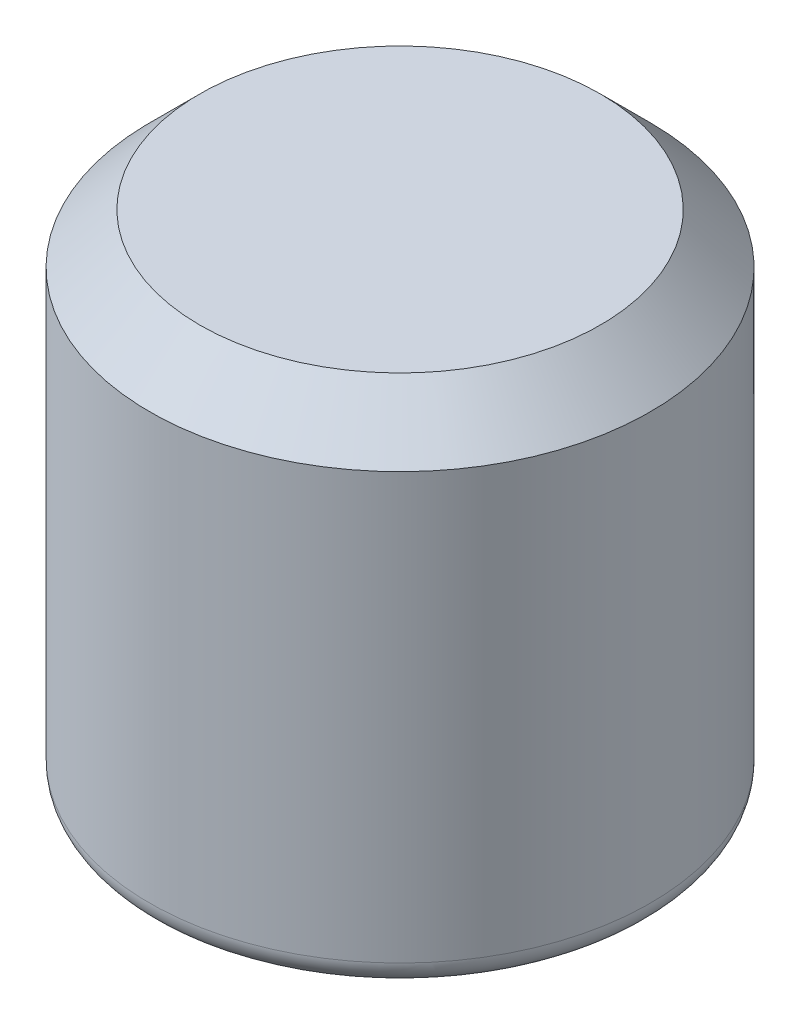
ISO-10303-21;
HEADER;
FILE_DESCRIPTION(('STEP AP214'),'2;1');
FILE_NAME('part.step','',(''),(''),'','','');
FILE_SCHEMA(('AUTOMOTIVE_DESIGN { 1 0 10303 214 1 1 1 1 }'));
ENDSEC;
DATA;
#1=APPLICATION_CONTEXT('core data for automotive mechanical design processes');
#2=APPLICATION_PROTOCOL_DEFINITION('international standard','automotive_design',2000,#1);
#3=PRODUCT_CONTEXT('',#1,'mechanical');
#4=PRODUCT('Part','Part','',(#3));
#5=PRODUCT_RELATED_PRODUCT_CATEGORY('part','',(#4));
#6=PRODUCT_DEFINITION_FORMATION('','',#4);
#7=PRODUCT_DEFINITION_CONTEXT('part definition',#1,'design');
#8=PRODUCT_DEFINITION('design','',#6,#7);
#9=PRODUCT_DEFINITION_SHAPE('','',#8);
#10=(LENGTH_UNIT() NAMED_UNIT(*) SI_UNIT(.MILLI.,.METRE.));
#11=(NAMED_UNIT(*) PLANE_ANGLE_UNIT() SI_UNIT($,.RADIAN.));
#12=(NAMED_UNIT(*) SI_UNIT($,.STERADIAN.) SOLID_ANGLE_UNIT());
#13=UNCERTAINTY_MEASURE_WITH_UNIT(LENGTH_MEASURE(1.E-05),#10,'distance_accuracy_value','');
#14=(GEOMETRIC_REPRESENTATION_CONTEXT(3) GLOBAL_UNCERTAINTY_ASSIGNED_CONTEXT((#13)) GLOBAL_UNIT_ASSIGNED_CONTEXT((#10,
#11,#12)) REPRESENTATION_CONTEXT('',''));
#15=CARTESIAN_POINT('',(0.,0.,0.));
#16=DIRECTION('',(0.,0.,1.));
#17=DIRECTION('',(1.,0.,0.));
#18=AXIS2_PLACEMENT_3D('',#15,#16,#17);
#19=CARTESIAN_POINT('',(0.,0.,0.));
#20=DIRECTION('',(0.,-1.,0.));
#21=DIRECTION('',(0.,0.,-1.));
#22=AXIS2_PLACEMENT_3D('',#19,#20,#21);
#23=PLANE('',#22);
#24=CARTESIAN_POINT('',(0.,0.,0.));
#25=DIRECTION('',(0.,-1.,0.));
#26=DIRECTION('',(0.,0.,-1.));
#27=AXIS2_PLACEMENT_3D('',#24,#25,#26);
#28=CIRCLE('',#27,9.);
#29=CARTESIAN_POINT('',(0.,0.,-9.));
#30=VERTEX_POINT('',#29);
#31=EDGE_CURVE('E47',#30,#30,#28,.T.);
#32=ORIENTED_EDGE('',*,*,#31,.T.);
#33=EDGE_LOOP('',(#32));
#34=FACE_BOUND('',#33,.T.);
#35=ADVANCED_FACE('F40',(#34),#23,.T.);
#36=CARTESIAN_POINT('',(0.,-10.,0.));
#37=DIRECTION('',(0.,-1.,0.));
#38=DIRECTION('',(0.,0.,-1.));
#39=AXIS2_PLACEMENT_3D('',#36,#37,#38);
#40=CYLINDRICAL_SURFACE('',#39,10.);
#41=CARTESIAN_POINT('',(0.,0.999999999999999,0.));
#42=DIRECTION('',(0.,-1.,0.));
#43=DIRECTION('',(0.,0.,-1.));
#44=AXIS2_PLACEMENT_3D('',#41,#42,#43);
#45=CIRCLE('',#44,10.);
#46=CARTESIAN_POINT('',(0.,0.999999999999999,-10.));
#47=VERTEX_POINT('',#46);
#48=EDGE_CURVE('E10',#47,#47,#45,.F.);
#49=ORIENTED_EDGE('',*,*,#48,.T.);
#50=EDGE_LOOP('',(#49));
#51=FACE_BOUND('',#50,.T.);
#52=CARTESIAN_POINT('',(0.,18.,0.));
#53=DIRECTION('',(0.,-1.,0.));
#54=DIRECTION('',(0.,0.,-1.));
#55=AXIS2_PLACEMENT_3D('',#52,#53,#54);
#56=CIRCLE('',#55,10.);
#57=CARTESIAN_POINT('',(0.,18.,-10.));
#58=VERTEX_POINT('',#57);
#59=EDGE_CURVE('E51',#58,#58,#56,.T.);
#60=ORIENTED_EDGE('',*,*,#59,.T.);
#61=EDGE_LOOP('',(#60));
#62=FACE_BOUND('',#61,.T.);
#63=ADVANCED_FACE('F73',(#51,#62),#40,.T.);
#64=CARTESIAN_POINT('',(0.,18.,0.));
#65=DIRECTION('',(0.,-1.,0.));
#66=DIRECTION('',(0.,0.,-1.));
#67=AXIS2_PLACEMENT_3D('',#64,#65,#66);
#68=CONICAL_SURFACE('',#67,10.,0.785398163397448);
#69=CARTESIAN_POINT('',(0.,20.,0.));
#70=DIRECTION('',(0.,-1.,0.));
#71=DIRECTION('',(0.,0.,-1.));
#72=AXIS2_PLACEMENT_3D('',#69,#70,#71);
#73=CIRCLE('',#72,8.);
#74=CARTESIAN_POINT('',(0.,20.,-8.));
#75=VERTEX_POINT('',#74);
#76=EDGE_CURVE('E55',#75,#75,#73,.T.);
#77=ORIENTED_EDGE('',*,*,#76,.T.);
#78=EDGE_LOOP('',(#77));
#79=FACE_BOUND('',#78,.T.);
#80=ORIENTED_EDGE('',*,*,#59,.F.);
#81=EDGE_LOOP('',(#80));
#82=FACE_BOUND('',#81,.T.);
#83=ADVANCED_FACE('F61',(#79,#82),#68,.T.);
#84=CARTESIAN_POINT('',(8.,20.,0.));
#85=DIRECTION('',(0.,1.,0.));
#86=DIRECTION('',(0.,0.,1.));
#87=AXIS2_PLACEMENT_3D('',#84,#85,#86);
#88=PLANE('',#87);
#89=ORIENTED_EDGE('',*,*,#76,.F.);
#90=EDGE_LOOP('',(#89));
#91=FACE_BOUND('',#90,.T.);
#92=ADVANCED_FACE('F64',(#91),#88,.T.);
#93=CARTESIAN_POINT('',(0.,0.999999999999999,0.));
#94=DIRECTION('',(0.,-1.,0.));
#95=DIRECTION('',(0.,0.,-1.));
#96=AXIS2_PLACEMENT_3D('',#93,#94,#95);
#97=TOROIDAL_SURFACE('',#96,9.,1.);
#98=ORIENTED_EDGE('',*,*,#48,.F.);
#99=EDGE_LOOP('',(#98));
#100=FACE_BOUND('',#99,.T.);
#101=ORIENTED_EDGE('',*,*,#31,.F.);
#102=EDGE_LOOP('',(#101));
#103=FACE_BOUND('',#102,.T.);
#104=ADVANCED_FACE('F42',(#100,#103),#97,.T.);
#105=CLOSED_SHELL('',(#35,#63,#83,#92,#104));
#106=MANIFOLD_SOLID_BREP('B2',#105);
#107=ADVANCED_BREP_SHAPE_REPRESENTATION('',(#18,#106),#14);
#108=SHAPE_DEFINITION_REPRESENTATION(#9,#107);
ENDSEC;
END-ISO-10303-21;
